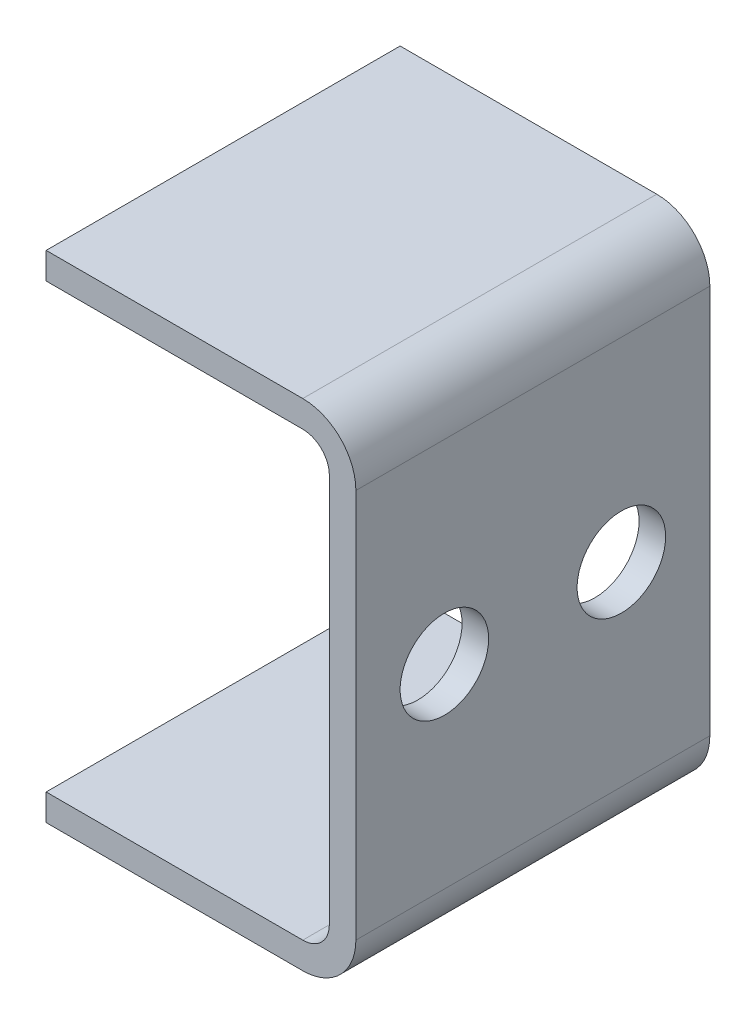
ISO-10303-21;
HEADER;
FILE_DESCRIPTION(('STEP AP214'),'2;1');
FILE_NAME('part.step','',(''),(''),'','','');
FILE_SCHEMA(('AUTOMOTIVE_DESIGN { 1 0 10303 214 1 1 1 1 }'));
ENDSEC;
DATA;
#1=APPLICATION_CONTEXT('core data for automotive mechanical design processes');
#2=APPLICATION_PROTOCOL_DEFINITION('international standard','automotive_design',2000,#1);
#3=PRODUCT_CONTEXT('',#1,'mechanical');
#4=PRODUCT('Part','Part','',(#3));
#5=PRODUCT_RELATED_PRODUCT_CATEGORY('part','',(#4));
#6=PRODUCT_DEFINITION_FORMATION('','',#4);
#7=PRODUCT_DEFINITION_CONTEXT('part definition',#1,'design');
#8=PRODUCT_DEFINITION('design','',#6,#7);
#9=PRODUCT_DEFINITION_SHAPE('','',#8);
#10=(LENGTH_UNIT() NAMED_UNIT(*) SI_UNIT(.MILLI.,.METRE.));
#11=(NAMED_UNIT(*) PLANE_ANGLE_UNIT() SI_UNIT($,.RADIAN.));
#12=(NAMED_UNIT(*) SI_UNIT($,.STERADIAN.) SOLID_ANGLE_UNIT());
#13=UNCERTAINTY_MEASURE_WITH_UNIT(LENGTH_MEASURE(1.E-05),#10,'distance_accuracy_value','');
#14=(GEOMETRIC_REPRESENTATION_CONTEXT(3) GLOBAL_UNCERTAINTY_ASSIGNED_CONTEXT((#13)) GLOBAL_UNIT_ASSIGNED_CONTEXT((#10,
#11,#12)) REPRESENTATION_CONTEXT('',''));
#15=CARTESIAN_POINT('',(0.,0.,0.));
#16=DIRECTION('',(0.,0.,1.));
#17=DIRECTION('',(1.,0.,0.));
#18=AXIS2_PLACEMENT_3D('',#15,#16,#17);
#19=CARTESIAN_POINT('',(-8.,-25.,-50.));
#20=DIRECTION('',(0.,1.,0.));
#21=DIRECTION('',(0.,0.,1.));
#22=AXIS2_PLACEMENT_3D('',#19,#20,#21);
#23=PLANE('',#22);
#24=DIRECTION('',(0.,0.,1.));
#25=VECTOR('',#24,1.);
#26=CARTESIAN_POINT('',(21.,-25.,-50.));
#27=LINE('',#26,#25);
#28=CARTESIAN_POINT('',(21.,-25.,-45.));
#29=VERTEX_POINT('',#28);
#30=CARTESIAN_POINT('',(21.,-25.,-5.));
#31=VERTEX_POINT('',#30);
#32=EDGE_CURVE('E135',#29,#31,#27,.T.);
#33=ORIENTED_EDGE('',*,*,#32,.F.);
#34=DIRECTION('',(-1.,0.,0.));
#35=VECTOR('',#34,1.);
#36=CARTESIAN_POINT('',(-8.,-25.,-45.));
#37=LINE('',#36,#35);
#38=CARTESIAN_POINT('',(-8.,-25.,-45.));
#39=VERTEX_POINT('',#38);
#40=EDGE_CURVE('E130',#29,#39,#37,.T.);
#41=ORIENTED_EDGE('',*,*,#40,.T.);
#42=DIRECTION('',(0.,0.,1.));
#43=VECTOR('',#42,1.);
#44=CARTESIAN_POINT('',(-8.,-25.,-50.));
#45=LINE('',#44,#43);
#46=CARTESIAN_POINT('',(-8.,-25.,-5.));
#47=VERTEX_POINT('',#46);
#48=EDGE_CURVE('E64',#39,#47,#45,.T.);
#49=ORIENTED_EDGE('',*,*,#48,.T.);
#50=DIRECTION('',(1.,0.,0.));
#51=VECTOR('',#50,1.);
#52=CARTESIAN_POINT('',(-8.,-25.,-5.));
#53=LINE('',#52,#51);
#54=EDGE_CURVE('E213',#47,#31,#53,.T.);
#55=ORIENTED_EDGE('',*,*,#54,.T.);
#56=EDGE_LOOP('',(#33,#41,#49,#55));
#57=FACE_BOUND('',#56,.T.);
#58=ADVANCED_FACE('F43',(#57),#23,.T.);
#59=CARTESIAN_POINT('',(21.,-22.,-50.));
#60=DIRECTION('',(0.,0.,1.));
#61=DIRECTION('',(1.,0.,0.));
#62=AXIS2_PLACEMENT_3D('',#59,#60,#61);
#63=CYLINDRICAL_SURFACE('',#62,3.);
#64=DIRECTION('',(0.,0.,1.));
#65=VECTOR('',#64,1.);
#66=CARTESIAN_POINT('',(24.,-22.,-50.));
#67=LINE('',#66,#65);
#68=CARTESIAN_POINT('',(24.,-22.,-45.));
#69=VERTEX_POINT('',#68);
#70=CARTESIAN_POINT('',(24.,-22.,-5.));
#71=VERTEX_POINT('',#70);
#72=EDGE_CURVE('E154',#69,#71,#67,.T.);
#73=ORIENTED_EDGE('',*,*,#72,.F.);
#74=CARTESIAN_POINT('',(21.,-22.,-45.));
#75=DIRECTION('',(0.,0.,-1.));
#76=DIRECTION('',(-1.,0.,0.));
#77=AXIS2_PLACEMENT_3D('',#74,#75,#76);
#78=CIRCLE('',#77,3.);
#79=EDGE_CURVE('E137',#69,#29,#78,.T.);
#80=ORIENTED_EDGE('',*,*,#79,.T.);
#81=ORIENTED_EDGE('',*,*,#32,.T.);
#82=CARTESIAN_POINT('',(21.,-22.,-5.));
#83=DIRECTION('',(0.,0.,1.));
#84=DIRECTION('',(1.,0.,0.));
#85=AXIS2_PLACEMENT_3D('',#82,#83,#84);
#86=CIRCLE('',#85,3.);
#87=EDGE_CURVE('E211',#31,#71,#86,.T.);
#88=ORIENTED_EDGE('',*,*,#87,.T.);
#89=EDGE_LOOP('',(#73,#80,#81,#88));
#90=FACE_BOUND('',#89,.T.);
#91=ADVANCED_FACE('F230',(#90),#63,.F.);
#92=CARTESIAN_POINT('',(24.,25.,-50.));
#93=DIRECTION('',(-1.,0.,0.));
#94=DIRECTION('',(0.,0.,1.));
#95=AXIS2_PLACEMENT_3D('',#92,#93,#94);
#96=PLANE('',#95);
#97=CARTESIAN_POINT('',(24.,0.,-15.));
#98=DIRECTION('',(-1.,0.,0.));
#99=DIRECTION('',(0.,0.,1.));
#100=AXIS2_PLACEMENT_3D('',#97,#98,#99);
#101=CIRCLE('',#100,5.);
#102=CARTESIAN_POINT('',(24.,0.,-9.99999999999999));
#103=VERTEX_POINT('',#102);
#104=EDGE_CURVE('E143',#103,#103,#101,.T.);
#105=ORIENTED_EDGE('',*,*,#104,.F.);
#106=EDGE_LOOP('',(#105));
#107=FACE_BOUND('',#106,.T.);
#108=CARTESIAN_POINT('',(24.,0.,-35.));
#109=DIRECTION('',(-1.,0.,0.));
#110=DIRECTION('',(0.,0.,1.));
#111=AXIS2_PLACEMENT_3D('',#108,#109,#110);
#112=CIRCLE('',#111,5.);
#113=CARTESIAN_POINT('',(24.,0.,-30.));
#114=VERTEX_POINT('',#113);
#115=EDGE_CURVE('E148',#114,#114,#112,.T.);
#116=ORIENTED_EDGE('',*,*,#115,.F.);
#117=EDGE_LOOP('',(#116));
#118=FACE_BOUND('',#117,.T.);
#119=DIRECTION('',(0.,0.,1.));
#120=VECTOR('',#119,1.);
#121=CARTESIAN_POINT('',(24.,22.,-50.));
#122=LINE('',#121,#120);
#123=CARTESIAN_POINT('',(24.,22.,-45.));
#124=VERTEX_POINT('',#123);
#125=CARTESIAN_POINT('',(24.,22.,-5.));
#126=VERTEX_POINT('',#125);
#127=EDGE_CURVE('E159',#124,#126,#122,.T.);
#128=ORIENTED_EDGE('',*,*,#127,.F.);
#129=DIRECTION('',(0.,-1.,0.));
#130=VECTOR('',#129,1.);
#131=CARTESIAN_POINT('',(24.,25.,-45.));
#132=LINE('',#131,#130);
#133=EDGE_CURVE('E235',#124,#69,#132,.T.);
#134=ORIENTED_EDGE('',*,*,#133,.T.);
#135=ORIENTED_EDGE('',*,*,#72,.T.);
#136=DIRECTION('',(0.,1.,0.));
#137=VECTOR('',#136,1.);
#138=CARTESIAN_POINT('',(24.,25.,-5.));
#139=LINE('',#138,#137);
#140=EDGE_CURVE('E208',#71,#126,#139,.T.);
#141=ORIENTED_EDGE('',*,*,#140,.T.);
#142=EDGE_LOOP('',(#128,#134,#135,#141));
#143=FACE_BOUND('',#142,.T.);
#144=ADVANCED_FACE('F226',(#107,#118,#143),#96,.T.);
#145=CARTESIAN_POINT('',(21.,22.,-50.));
#146=DIRECTION('',(0.,0.,1.));
#147=DIRECTION('',(1.,0.,0.));
#148=AXIS2_PLACEMENT_3D('',#145,#146,#147);
#149=CYLINDRICAL_SURFACE('',#148,3.);
#150=DIRECTION('',(0.,0.,1.));
#151=VECTOR('',#150,1.);
#152=CARTESIAN_POINT('',(21.,25.,-50.));
#153=LINE('',#152,#151);
#154=CARTESIAN_POINT('',(21.,25.,-45.));
#155=VERTEX_POINT('',#154);
#156=CARTESIAN_POINT('',(21.,25.,-5.));
#157=VERTEX_POINT('',#156);
#158=EDGE_CURVE('E164',#155,#157,#153,.T.);
#159=ORIENTED_EDGE('',*,*,#158,.F.);
#160=CARTESIAN_POINT('',(21.,22.,-45.));
#161=DIRECTION('',(0.,0.,-1.));
#162=DIRECTION('',(-1.,0.,0.));
#163=AXIS2_PLACEMENT_3D('',#160,#161,#162);
#164=CIRCLE('',#163,3.);
#165=EDGE_CURVE('E242',#155,#124,#164,.T.);
#166=ORIENTED_EDGE('',*,*,#165,.T.);
#167=ORIENTED_EDGE('',*,*,#127,.T.);
#168=CARTESIAN_POINT('',(21.,22.,-5.));
#169=DIRECTION('',(0.,0.,1.));
#170=DIRECTION('',(1.,0.,0.));
#171=AXIS2_PLACEMENT_3D('',#168,#169,#170);
#172=CIRCLE('',#171,3.);
#173=EDGE_CURVE('E205',#126,#157,#172,.T.);
#174=ORIENTED_EDGE('',*,*,#173,.T.);
#175=EDGE_LOOP('',(#159,#166,#167,#174));
#176=FACE_BOUND('',#175,.T.);
#177=ADVANCED_FACE('F229',(#176),#149,.F.);
#178=CARTESIAN_POINT('',(-8.,25.,-50.));
#179=DIRECTION('',(0.,-1.,0.));
#180=DIRECTION('',(0.,0.,-1.));
#181=AXIS2_PLACEMENT_3D('',#178,#179,#180);
#182=PLANE('',#181);
#183=DIRECTION('',(0.,0.,1.));
#184=VECTOR('',#183,1.);
#185=CARTESIAN_POINT('',(-8.,25.,-50.));
#186=LINE('',#185,#184);
#187=CARTESIAN_POINT('',(-8.,25.,-45.));
#188=VERTEX_POINT('',#187);
#189=CARTESIAN_POINT('',(-8.,25.,-5.));
#190=VERTEX_POINT('',#189);
#191=EDGE_CURVE('E166',#188,#190,#186,.T.);
#192=ORIENTED_EDGE('',*,*,#191,.F.);
#193=DIRECTION('',(1.,0.,0.));
#194=VECTOR('',#193,1.);
#195=CARTESIAN_POINT('',(-8.,25.,-45.));
#196=LINE('',#195,#194);
#197=EDGE_CURVE('E249',#188,#155,#196,.T.);
#198=ORIENTED_EDGE('',*,*,#197,.T.);
#199=ORIENTED_EDGE('',*,*,#158,.T.);
#200=DIRECTION('',(-1.,0.,0.));
#201=VECTOR('',#200,1.);
#202=CARTESIAN_POINT('',(-8.,25.,-5.));
#203=LINE('',#202,#201);
#204=EDGE_CURVE('E202',#157,#190,#203,.T.);
#205=ORIENTED_EDGE('',*,*,#204,.T.);
#206=EDGE_LOOP('',(#192,#198,#199,#205));
#207=FACE_BOUND('',#206,.T.);
#208=ADVANCED_FACE('F247',(#207),#182,.T.);
#209=CARTESIAN_POINT('',(-8.,25.,-50.));
#210=DIRECTION('',(1.,0.,0.));
#211=DIRECTION('',(0.,0.,-1.));
#212=AXIS2_PLACEMENT_3D('',#209,#210,#211);
#213=PLANE('',#212);
#214=DIRECTION('',(0.,1.,0.));
#215=VECTOR('',#214,1.);
#216=CARTESIAN_POINT('',(-8.,25.,-45.));
#217=LINE('',#216,#215);
#218=CARTESIAN_POINT('',(-8.,28.,-45.));
#219=VERTEX_POINT('',#218);
#220=EDGE_CURVE('E251',#188,#219,#217,.T.);
#221=ORIENTED_EDGE('',*,*,#220,.F.);
#222=ORIENTED_EDGE('',*,*,#191,.T.);
#223=DIRECTION('',(0.,-1.,0.));
#224=VECTOR('',#223,1.);
#225=CARTESIAN_POINT('',(-8.,25.,-5.));
#226=LINE('',#225,#224);
#227=CARTESIAN_POINT('',(-8.,28.,-5.));
#228=VERTEX_POINT('',#227);
#229=EDGE_CURVE('E199',#228,#190,#226,.T.);
#230=ORIENTED_EDGE('',*,*,#229,.F.);
#231=DIRECTION('',(0.,0.,1.));
#232=VECTOR('',#231,1.);
#233=CARTESIAN_POINT('',(-8.,28.,-50.));
#234=LINE('',#233,#232);
#235=EDGE_CURVE('E168',#219,#228,#234,.T.);
#236=ORIENTED_EDGE('',*,*,#235,.F.);
#237=EDGE_LOOP('',(#221,#222,#230,#236));
#238=FACE_BOUND('',#237,.T.);
#239=ADVANCED_FACE('F271',(#238),#213,.F.);
#240=CARTESIAN_POINT('',(-8.,28.,-50.));
#241=DIRECTION('',(0.,-1.,0.));
#242=DIRECTION('',(0.,0.,-1.));
#243=AXIS2_PLACEMENT_3D('',#240,#241,#242);
#244=PLANE('',#243);
#245=DIRECTION('',(1.,0.,0.));
#246=VECTOR('',#245,1.);
#247=CARTESIAN_POINT('',(-8.,28.,-45.));
#248=LINE('',#247,#246);
#249=CARTESIAN_POINT('',(21.,28.,-45.));
#250=VERTEX_POINT('',#249);
#251=EDGE_CURVE('E254',#219,#250,#248,.T.);
#252=ORIENTED_EDGE('',*,*,#251,.F.);
#253=ORIENTED_EDGE('',*,*,#235,.T.);
#254=DIRECTION('',(-1.,0.,0.));
#255=VECTOR('',#254,1.);
#256=CARTESIAN_POINT('',(-8.,28.,-5.));
#257=LINE('',#256,#255);
#258=CARTESIAN_POINT('',(21.,28.,-5.));
#259=VERTEX_POINT('',#258);
#260=EDGE_CURVE('E196',#259,#228,#257,.T.);
#261=ORIENTED_EDGE('',*,*,#260,.F.);
#262=DIRECTION('',(0.,0.,1.));
#263=VECTOR('',#262,1.);
#264=CARTESIAN_POINT('',(21.,28.,-50.));
#265=LINE('',#264,#263);
#266=EDGE_CURVE('E170',#250,#259,#265,.T.);
#267=ORIENTED_EDGE('',*,*,#266,.F.);
#268=EDGE_LOOP('',(#252,#253,#261,#267));
#269=FACE_BOUND('',#268,.T.);
#270=ADVANCED_FACE('F274',(#269),#244,.F.);
#271=CARTESIAN_POINT('',(21.,22.,-50.));
#272=DIRECTION('',(0.,0.,1.));
#273=DIRECTION('',(1.,0.,0.));
#274=AXIS2_PLACEMENT_3D('',#271,#272,#273);
#275=CYLINDRICAL_SURFACE('',#274,6.);
#276=CARTESIAN_POINT('',(21.,22.,-45.));
#277=DIRECTION('',(0.,0.,-1.));
#278=DIRECTION('',(-1.,0.,0.));
#279=AXIS2_PLACEMENT_3D('',#276,#277,#278);
#280=CIRCLE('',#279,6.);
#281=CARTESIAN_POINT('',(27.,22.,-45.));
#282=VERTEX_POINT('',#281);
#283=EDGE_CURVE('E430',#250,#282,#280,.T.);
#284=ORIENTED_EDGE('',*,*,#283,.F.);
#285=ORIENTED_EDGE('',*,*,#266,.T.);
#286=CARTESIAN_POINT('',(21.,22.,-5.));
#287=DIRECTION('',(0.,0.,1.));
#288=DIRECTION('',(1.,0.,0.));
#289=AXIS2_PLACEMENT_3D('',#286,#287,#288);
#290=CIRCLE('',#289,6.);
#291=CARTESIAN_POINT('',(27.,22.,-5.));
#292=VERTEX_POINT('',#291);
#293=EDGE_CURVE('E191',#292,#259,#290,.T.);
#294=ORIENTED_EDGE('',*,*,#293,.F.);
#295=DIRECTION('',(0.,0.,1.));
#296=VECTOR('',#295,1.);
#297=CARTESIAN_POINT('',(27.,22.,-50.));
#298=LINE('',#297,#296);
#299=EDGE_CURVE('E172',#282,#292,#298,.T.);
#300=ORIENTED_EDGE('',*,*,#299,.F.);
#301=EDGE_LOOP('',(#284,#285,#294,#300));
#302=FACE_BOUND('',#301,.T.);
#303=ADVANCED_FACE('F278',(#302),#275,.T.);
#304=CARTESIAN_POINT('',(27.,25.,-50.));
#305=DIRECTION('',(-1.,0.,0.));
#306=DIRECTION('',(0.,0.,1.));
#307=AXIS2_PLACEMENT_3D('',#304,#305,#306);
#308=PLANE('',#307);
#309=CARTESIAN_POINT('',(27.,0.,-15.));
#310=DIRECTION('',(1.,0.,0.));
#311=DIRECTION('',(0.,0.,-1.));
#312=AXIS2_PLACEMENT_3D('',#309,#310,#311);
#313=CIRCLE('',#312,5.);
#314=CARTESIAN_POINT('',(27.,0.,-20.));
#315=VERTEX_POINT('',#314);
#316=EDGE_CURVE('E216',#315,#315,#313,.T.);
#317=ORIENTED_EDGE('',*,*,#316,.F.);
#318=EDGE_LOOP('',(#317));
#319=FACE_BOUND('',#318,.T.);
#320=CARTESIAN_POINT('',(27.,0.,-35.));
#321=DIRECTION('',(1.,0.,0.));
#322=DIRECTION('',(0.,0.,-1.));
#323=AXIS2_PLACEMENT_3D('',#320,#321,#322);
#324=CIRCLE('',#323,5.);
#325=CARTESIAN_POINT('',(27.,0.,-40.));
#326=VERTEX_POINT('',#325);
#327=EDGE_CURVE('E215',#326,#326,#324,.T.);
#328=ORIENTED_EDGE('',*,*,#327,.F.);
#329=EDGE_LOOP('',(#328));
#330=FACE_BOUND('',#329,.T.);
#331=DIRECTION('',(0.,-1.,0.));
#332=VECTOR('',#331,1.);
#333=CARTESIAN_POINT('',(27.,25.,-45.));
#334=LINE('',#333,#332);
#335=CARTESIAN_POINT('',(27.,-22.,-45.));
#336=VERTEX_POINT('',#335);
#337=EDGE_CURVE('E428',#282,#336,#334,.T.);
#338=ORIENTED_EDGE('',*,*,#337,.F.);
#339=ORIENTED_EDGE('',*,*,#299,.T.);
#340=DIRECTION('',(0.,1.,0.));
#341=VECTOR('',#340,1.);
#342=CARTESIAN_POINT('',(27.,25.,-5.));
#343=LINE('',#342,#341);
#344=CARTESIAN_POINT('',(27.,-22.,-5.));
#345=VERTEX_POINT('',#344);
#346=EDGE_CURVE('E189',#345,#292,#343,.T.);
#347=ORIENTED_EDGE('',*,*,#346,.F.);
#348=DIRECTION('',(0.,0.,1.));
#349=VECTOR('',#348,1.);
#350=CARTESIAN_POINT('',(27.,-22.,-50.));
#351=LINE('',#350,#349);
#352=EDGE_CURVE('E174',#336,#345,#351,.T.);
#353=ORIENTED_EDGE('',*,*,#352,.F.);
#354=EDGE_LOOP('',(#338,#339,#347,#353));
#355=FACE_BOUND('',#354,.T.);
#356=ADVANCED_FACE('F282',(#319,#330,#355),#308,.F.);
#357=CARTESIAN_POINT('',(21.,-22.,-50.));
#358=DIRECTION('',(0.,0.,1.));
#359=DIRECTION('',(1.,0.,0.));
#360=AXIS2_PLACEMENT_3D('',#357,#358,#359);
#361=CYLINDRICAL_SURFACE('',#360,6.);
#362=CARTESIAN_POINT('',(21.,-22.,-45.));
#363=DIRECTION('',(0.,0.,-1.));
#364=DIRECTION('',(-1.,0.,0.));
#365=AXIS2_PLACEMENT_3D('',#362,#363,#364);
#366=CIRCLE('',#365,6.);
#367=CARTESIAN_POINT('',(21.,-28.,-45.));
#368=VERTEX_POINT('',#367);
#369=EDGE_CURVE('E431',#336,#368,#366,.T.);
#370=ORIENTED_EDGE('',*,*,#369,.F.);
#371=ORIENTED_EDGE('',*,*,#352,.T.);
#372=CARTESIAN_POINT('',(21.,-22.,-5.));
#373=DIRECTION('',(0.,0.,1.));
#374=DIRECTION('',(1.,0.,0.));
#375=AXIS2_PLACEMENT_3D('',#372,#373,#374);
#376=CIRCLE('',#375,6.);
#377=CARTESIAN_POINT('',(21.,-28.,-5.));
#378=VERTEX_POINT('',#377);
#379=EDGE_CURVE('E184',#378,#345,#376,.T.);
#380=ORIENTED_EDGE('',*,*,#379,.F.);
#381=DIRECTION('',(0.,0.,1.));
#382=VECTOR('',#381,1.);
#383=CARTESIAN_POINT('',(21.,-28.,-50.));
#384=LINE('',#383,#382);
#385=EDGE_CURVE('E145',#368,#378,#384,.T.);
#386=ORIENTED_EDGE('',*,*,#385,.F.);
#387=EDGE_LOOP('',(#370,#371,#380,#386));
#388=FACE_BOUND('',#387,.T.);
#389=ADVANCED_FACE('F187',(#388),#361,.T.);
#390=CARTESIAN_POINT('',(-8.,-28.,-50.));
#391=DIRECTION('',(0.,1.,0.));
#392=DIRECTION('',(0.,0.,1.));
#393=AXIS2_PLACEMENT_3D('',#390,#391,#392);
#394=PLANE('',#393);
#395=DIRECTION('',(-1.,0.,0.));
#396=VECTOR('',#395,1.);
#397=CARTESIAN_POINT('',(-8.,-28.,-45.));
#398=LINE('',#397,#396);
#399=CARTESIAN_POINT('',(-8.,-28.,-45.));
#400=VERTEX_POINT('',#399);
#401=EDGE_CURVE('E56',#368,#400,#398,.T.);
#402=ORIENTED_EDGE('',*,*,#401,.F.);
#403=ORIENTED_EDGE('',*,*,#385,.T.);
#404=DIRECTION('',(1.,0.,0.));
#405=VECTOR('',#404,1.);
#406=CARTESIAN_POINT('',(-8.,-28.,-5.));
#407=LINE('',#406,#405);
#408=CARTESIAN_POINT('',(-8.,-28.,-5.));
#409=VERTEX_POINT('',#408);
#410=EDGE_CURVE('E136',#409,#378,#407,.T.);
#411=ORIENTED_EDGE('',*,*,#410,.F.);
#412=DIRECTION('',(0.,0.,1.));
#413=VECTOR('',#412,1.);
#414=CARTESIAN_POINT('',(-8.,-28.,-50.));
#415=LINE('',#414,#413);
#416=EDGE_CURVE('E142',#400,#409,#415,.T.);
#417=ORIENTED_EDGE('',*,*,#416,.F.);
#418=EDGE_LOOP('',(#402,#403,#411,#417));
#419=FACE_BOUND('',#418,.T.);
#420=ADVANCED_FACE('F177',(#419),#394,.F.);
#421=CARTESIAN_POINT('',(-8.,-28.,-50.));
#422=DIRECTION('',(1.,0.,0.));
#423=DIRECTION('',(0.,0.,-1.));
#424=AXIS2_PLACEMENT_3D('',#421,#422,#423);
#425=PLANE('',#424);
#426=DIRECTION('',(0.,1.,0.));
#427=VECTOR('',#426,1.);
#428=CARTESIAN_POINT('',(-8.,-28.,-45.));
#429=LINE('',#428,#427);
#430=EDGE_CURVE('E11',#400,#39,#429,.T.);
#431=ORIENTED_EDGE('',*,*,#430,.F.);
#432=ORIENTED_EDGE('',*,*,#416,.T.);
#433=DIRECTION('',(0.,-1.,0.));
#434=VECTOR('',#433,1.);
#435=CARTESIAN_POINT('',(-8.,-28.,-5.));
#436=LINE('',#435,#434);
#437=EDGE_CURVE('E50',#47,#409,#436,.T.);
#438=ORIENTED_EDGE('',*,*,#437,.F.);
#439=ORIENTED_EDGE('',*,*,#48,.F.);
#440=EDGE_LOOP('',(#431,#432,#438,#439));
#441=FACE_BOUND('',#440,.T.);
#442=ADVANCED_FACE('F140',(#441),#425,.F.);
#443=CARTESIAN_POINT('',(-8.,0.,-35.));
#444=DIRECTION('',(1.,0.,0.));
#445=DIRECTION('',(0.,0.,-1.));
#446=AXIS2_PLACEMENT_3D('',#443,#444,#445);
#447=CYLINDRICAL_SURFACE('',#446,5.);
#448=ORIENTED_EDGE('',*,*,#115,.T.);
#449=EDGE_LOOP('',(#448));
#450=FACE_BOUND('',#449,.T.);
#451=ORIENTED_EDGE('',*,*,#327,.T.);
#452=EDGE_LOOP('',(#451));
#453=FACE_BOUND('',#452,.T.);
#454=ADVANCED_FACE('F223',(#450,#453),#447,.F.);
#455=CARTESIAN_POINT('',(-8.,0.,-15.));
#456=DIRECTION('',(1.,0.,0.));
#457=DIRECTION('',(0.,0.,-1.));
#458=AXIS2_PLACEMENT_3D('',#455,#456,#457);
#459=CYLINDRICAL_SURFACE('',#458,5.);
#460=ORIENTED_EDGE('',*,*,#104,.T.);
#461=EDGE_LOOP('',(#460));
#462=FACE_BOUND('',#461,.T.);
#463=ORIENTED_EDGE('',*,*,#316,.T.);
#464=EDGE_LOOP('',(#463));
#465=FACE_BOUND('',#464,.T.);
#466=ADVANCED_FACE('F295',(#462,#465),#459,.F.);
#467=CARTESIAN_POINT('',(0.,0.,-5.));
#468=DIRECTION('',(0.,0.,1.));
#469=DIRECTION('',(1.,0.,0.));
#470=AXIS2_PLACEMENT_3D('',#467,#468,#469);
#471=PLANE('',#470);
#472=ORIENTED_EDGE('',*,*,#437,.T.);
#473=ORIENTED_EDGE('',*,*,#410,.T.);
#474=ORIENTED_EDGE('',*,*,#379,.T.);
#475=ORIENTED_EDGE('',*,*,#346,.T.);
#476=ORIENTED_EDGE('',*,*,#293,.T.);
#477=ORIENTED_EDGE('',*,*,#260,.T.);
#478=ORIENTED_EDGE('',*,*,#229,.T.);
#479=ORIENTED_EDGE('',*,*,#204,.F.);
#480=ORIENTED_EDGE('',*,*,#173,.F.);
#481=ORIENTED_EDGE('',*,*,#140,.F.);
#482=ORIENTED_EDGE('',*,*,#87,.F.);
#483=ORIENTED_EDGE('',*,*,#54,.F.);
#484=EDGE_LOOP('',(#472,#473,#474,#475,#476,#477,#478,#479,#480,#481,#482,#483));
#485=FACE_BOUND('',#484,.T.);
#486=ADVANCED_FACE('F182',(#485),#471,.T.);
#487=CARTESIAN_POINT('',(0.,0.,-45.));
#488=DIRECTION('',(0.,0.,-1.));
#489=DIRECTION('',(1.,0.,0.));
#490=AXIS2_PLACEMENT_3D('',#487,#488,#489);
#491=PLANE('',#490);
#492=ORIENTED_EDGE('',*,*,#79,.F.);
#493=ORIENTED_EDGE('',*,*,#133,.F.);
#494=ORIENTED_EDGE('',*,*,#165,.F.);
#495=ORIENTED_EDGE('',*,*,#197,.F.);
#496=ORIENTED_EDGE('',*,*,#220,.T.);
#497=ORIENTED_EDGE('',*,*,#251,.T.);
#498=ORIENTED_EDGE('',*,*,#283,.T.);
#499=ORIENTED_EDGE('',*,*,#337,.T.);
#500=ORIENTED_EDGE('',*,*,#369,.T.);
#501=ORIENTED_EDGE('',*,*,#401,.T.);
#502=ORIENTED_EDGE('',*,*,#430,.T.);
#503=ORIENTED_EDGE('',*,*,#40,.F.);
#504=EDGE_LOOP('',(#492,#493,#494,#495,#496,#497,#498,#499,#500,#501,#502,#503));
#505=FACE_BOUND('',#504,.T.);
#506=ADVANCED_FACE('F129',(#505),#491,.T.);
#507=CLOSED_SHELL('',(#58,#91,#144,#177,#208,#239,#270,#303,#356,#389,#420,#442,#454,#466,#486,#506));
#508=MANIFOLD_SOLID_BREP('B2',#507);
#509=ADVANCED_BREP_SHAPE_REPRESENTATION('',(#18,#508),#14);
#510=SHAPE_DEFINITION_REPRESENTATION(#9,#509);
ENDSEC;
END-ISO-10303-21;
